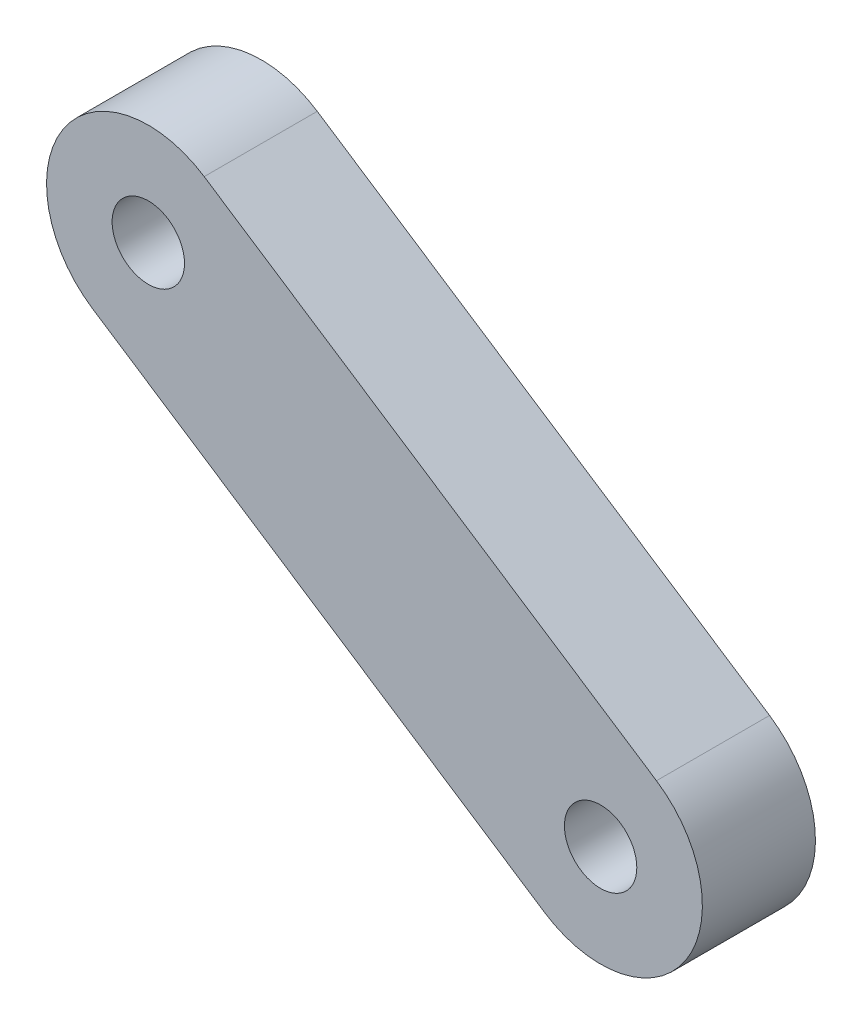
ISO-10303-21;
HEADER;
FILE_DESCRIPTION(('STEP AP214'),'2;1');
FILE_NAME('part.step','',(''),(''),'','','');
FILE_SCHEMA(('AUTOMOTIVE_DESIGN { 1 0 10303 214 1 1 1 1 }'));
ENDSEC;
DATA;
#1=APPLICATION_CONTEXT('core data for automotive mechanical design processes');
#2=APPLICATION_PROTOCOL_DEFINITION('international standard','automotive_design',2000,#1);
#3=PRODUCT_CONTEXT('',#1,'mechanical');
#4=PRODUCT('Part','Part','',(#3));
#5=PRODUCT_RELATED_PRODUCT_CATEGORY('part','',(#4));
#6=PRODUCT_DEFINITION_FORMATION('','',#4);
#7=PRODUCT_DEFINITION_CONTEXT('part definition',#1,'design');
#8=PRODUCT_DEFINITION('design','',#6,#7);
#9=PRODUCT_DEFINITION_SHAPE('','',#8);
#10=(LENGTH_UNIT() NAMED_UNIT(*) SI_UNIT(.MILLI.,.METRE.));
#11=(NAMED_UNIT(*) PLANE_ANGLE_UNIT() SI_UNIT($,.RADIAN.));
#12=(NAMED_UNIT(*) SI_UNIT($,.STERADIAN.) SOLID_ANGLE_UNIT());
#13=UNCERTAINTY_MEASURE_WITH_UNIT(LENGTH_MEASURE(1.E-05),#10,'distance_accuracy_value','');
#14=(GEOMETRIC_REPRESENTATION_CONTEXT(3) GLOBAL_UNCERTAINTY_ASSIGNED_CONTEXT((#13)) GLOBAL_UNIT_ASSIGNED_CONTEXT((#10,
#11,#12)) REPRESENTATION_CONTEXT('',''));
#15=CARTESIAN_POINT('',(0.,0.,0.));
#16=DIRECTION('',(0.,0.,1.));
#17=DIRECTION('',(1.,0.,0.));
#18=AXIS2_PLACEMENT_3D('',#15,#16,#17);
#19=CARTESIAN_POINT('',(-64.02985074626,0.,11.));
#20=DIRECTION('',(0.,0.,1.));
#21=DIRECTION('',(1.,0.,0.));
#22=AXIS2_PLACEMENT_3D('',#19,#20,#21);
#23=CYLINDRICAL_SURFACE('',#22,1.6);
#24=DIRECTION('',(0.,0.,1.));
#25=VECTOR('',#24,1.);
#26=CARTESIAN_POINT('',(-62.42985074626,0.,11.));
#27=LINE('',#26,#25);
#28=CARTESIAN_POINT('',(-62.42985074626,0.,18.5));
#29=VERTEX_POINT('',#28);
#30=CARTESIAN_POINT('',(-62.42985074626,0.,23.5));
#31=VERTEX_POINT('',#30);
#32=EDGE_CURVE('E10',#29,#31,#27,.T.);
#33=ORIENTED_EDGE('',*,*,#32,.F.);
#34=CARTESIAN_POINT('',(-64.02985074626,0.,18.5));
#35=DIRECTION('',(0.,0.,1.));
#36=DIRECTION('',(1.,0.,0.));
#37=AXIS2_PLACEMENT_3D('',#34,#35,#36);
#38=CIRCLE('',#37,1.6);
#39=EDGE_CURVE('E134',#29,#29,#38,.T.);
#40=ORIENTED_EDGE('',*,*,#39,.F.);
#41=ORIENTED_EDGE('',*,*,#32,.T.);
#42=CARTESIAN_POINT('',(-64.02985074626,0.,23.5));
#43=DIRECTION('',(0.,0.,1.));
#44=DIRECTION('',(1.,0.,0.));
#45=AXIS2_PLACEMENT_3D('',#42,#43,#44);
#46=CIRCLE('',#45,1.6);
#47=EDGE_CURVE('E116',#31,#31,#46,.T.);
#48=ORIENTED_EDGE('',*,*,#47,.T.);
#49=EDGE_LOOP('',(#33,#40,#41,#48));
#50=FACE_BOUND('',#49,.T.);
#51=ADVANCED_FACE('F16',(#50),#23,.F.);
#52=CARTESIAN_POINT('',(-44.02985074626,-13.1343283582,11.));
#53=DIRECTION('',(0.,0.,1.));
#54=DIRECTION('',(1.,0.,0.));
#55=AXIS2_PLACEMENT_3D('',#52,#53,#54);
#56=CYLINDRICAL_SURFACE('',#55,1.6);
#57=DIRECTION('',(0.,0.,1.));
#58=VECTOR('',#57,1.);
#59=CARTESIAN_POINT('',(-42.42985074626,-13.1343283582,11.));
#60=LINE('',#59,#58);
#61=CARTESIAN_POINT('',(-42.42985074626,-13.1343283582,18.5));
#62=VERTEX_POINT('',#61);
#63=CARTESIAN_POINT('',(-42.42985074626,-13.1343283582,23.5));
#64=VERTEX_POINT('',#63);
#65=EDGE_CURVE('E27',#62,#64,#60,.T.);
#66=ORIENTED_EDGE('',*,*,#65,.F.);
#67=CARTESIAN_POINT('',(-44.02985074626,-13.1343283582,18.5));
#68=DIRECTION('',(0.,0.,1.));
#69=DIRECTION('',(1.,0.,0.));
#70=AXIS2_PLACEMENT_3D('',#67,#68,#69);
#71=CIRCLE('',#70,1.6);
#72=EDGE_CURVE('E92',#62,#62,#71,.T.);
#73=ORIENTED_EDGE('',*,*,#72,.F.);
#74=ORIENTED_EDGE('',*,*,#65,.T.);
#75=CARTESIAN_POINT('',(-44.02985074626,-13.1343283582,23.5));
#76=DIRECTION('',(0.,0.,1.));
#77=DIRECTION('',(1.,0.,0.));
#78=AXIS2_PLACEMENT_3D('',#75,#76,#77);
#79=CIRCLE('',#78,1.6);
#80=EDGE_CURVE('E123',#64,#64,#79,.T.);
#81=ORIENTED_EDGE('',*,*,#80,.T.);
#82=EDGE_LOOP('',(#66,#73,#74,#81));
#83=FACE_BOUND('',#82,.T.);
#84=ADVANCED_FACE('F184',(#83),#56,.F.);
#85=CARTESIAN_POINT('',(-44.02985074626,-13.1343283582,18.5));
#86=DIRECTION('',(0.,0.,-1.));
#87=DIRECTION('',(-0.835869034479104,0.548928918166068,0.));
#88=AXIS2_PLACEMENT_3D('',#85,#86,#87);
#89=CYLINDRICAL_SURFACE('',#88,4.5);
#90=DIRECTION('',(0.,0.,1.));
#91=VECTOR('',#90,1.);
#92=CARTESIAN_POINT('',(-41.55967061452,-9.372917703052,18.5));
#93=LINE('',#92,#91);
#94=CARTESIAN_POINT('',(-41.55967061452,-9.372917703052,18.5));
#95=VERTEX_POINT('',#94);
#96=CARTESIAN_POINT('',(-41.55967061452,-9.372917703052,23.5));
#97=VERTEX_POINT('',#96);
#98=EDGE_CURVE('E85',#95,#97,#93,.T.);
#99=ORIENTED_EDGE('',*,*,#98,.T.);
#100=CARTESIAN_POINT('',(-44.02985074626,-13.1343283582,23.5));
#101=DIRECTION('',(0.,0.,-1.));
#102=DIRECTION('',(-0.835869034479104,0.548928918166068,0.));
#103=AXIS2_PLACEMENT_3D('',#100,#101,#102);
#104=CIRCLE('',#103,4.5);
#105=CARTESIAN_POINT('',(-46.50003087801,-16.89573901336,23.5));
#106=VERTEX_POINT('',#105);
#107=EDGE_CURVE('E73',#97,#106,#104,.T.);
#108=ORIENTED_EDGE('',*,*,#107,.T.);
#109=DIRECTION('',(0.,0.,1.));
#110=VECTOR('',#109,1.);
#111=CARTESIAN_POINT('',(-46.50003087801,-16.89573901336,18.5));
#112=LINE('',#111,#110);
#113=CARTESIAN_POINT('',(-46.50003087801,-16.89573901336,18.5));
#114=VERTEX_POINT('',#113);
#115=EDGE_CURVE('E20',#114,#106,#112,.T.);
#116=ORIENTED_EDGE('',*,*,#115,.F.);
#117=CARTESIAN_POINT('',(-44.02985074626,-13.1343283582,18.5));
#118=DIRECTION('',(0.,0.,-1.));
#119=DIRECTION('',(-0.835869034479104,0.548928918166068,0.));
#120=AXIS2_PLACEMENT_3D('',#117,#118,#119);
#121=CIRCLE('',#120,4.5);
#122=EDGE_CURVE('E81',#95,#114,#121,.T.);
#123=ORIENTED_EDGE('',*,*,#122,.F.);
#124=EDGE_LOOP('',(#99,#108,#116,#123));
#125=FACE_BOUND('',#124,.T.);
#126=ADVANCED_FACE('F83',(#125),#89,.T.);
#127=CARTESIAN_POINT('',(-54.02985074626,-6.567164179104,23.5));
#128=DIRECTION('',(0.,0.,1.));
#129=DIRECTION('',(1.,0.,0.));
#130=AXIS2_PLACEMENT_3D('',#127,#128,#129);
#131=PLANE('',#130);
#132=ORIENTED_EDGE('',*,*,#47,.F.);
#133=EDGE_LOOP('',(#132));
#134=FACE_BOUND('',#133,.T.);
#135=ORIENTED_EDGE('',*,*,#80,.F.);
#136=EDGE_LOOP('',(#135));
#137=FACE_BOUND('',#136,.T.);
#138=CARTESIAN_POINT('',(-64.02985074626,0.,23.5));
#139=DIRECTION('',(0.,0.,-1.));
#140=DIRECTION('',(0.835869034479104,-0.548928918166068,0.));
#141=AXIS2_PLACEMENT_3D('',#138,#139,#140);
#142=CIRCLE('',#141,4.5);
#143=CARTESIAN_POINT('',(-66.50003087801,-3.761410655157,23.5));
#144=VERTEX_POINT('',#143);
#145=CARTESIAN_POINT('',(-61.55967061452,3.761410655157,23.5));
#146=VERTEX_POINT('',#145);
#147=EDGE_CURVE('E136',#144,#146,#142,.T.);
#148=ORIENTED_EDGE('',*,*,#147,.F.);
#149=DIRECTION('',(-0.835869034479104,0.548928918166068,0.));
#150=VECTOR('',#149,1.);
#151=CARTESIAN_POINT('',(-46.50003087801,-16.89573901336,23.5));
#152=LINE('',#151,#150);
#153=EDGE_CURVE('E113',#106,#144,#152,.T.);
#154=ORIENTED_EDGE('',*,*,#153,.F.);
#155=ORIENTED_EDGE('',*,*,#107,.F.);
#156=DIRECTION('',(0.835869034479104,-0.548928918166068,0.));
#157=VECTOR('',#156,1.);
#158=CARTESIAN_POINT('',(-61.55967061452,3.761410655157,23.5));
#159=LINE('',#158,#157);
#160=EDGE_CURVE('E104',#146,#97,#159,.T.);
#161=ORIENTED_EDGE('',*,*,#160,.F.);
#162=EDGE_LOOP('',(#148,#154,#155,#161));
#163=FACE_BOUND('',#162,.T.);
#164=ADVANCED_FACE('F161',(#134,#137,#163),#131,.T.);
#165=CARTESIAN_POINT('',(-54.02985074626,-6.567164179104,18.5));
#166=DIRECTION('',(0.,0.,1.));
#167=DIRECTION('',(1.,0.,0.));
#168=AXIS2_PLACEMENT_3D('',#165,#166,#167);
#169=PLANE('',#168);
#170=ORIENTED_EDGE('',*,*,#39,.T.);
#171=EDGE_LOOP('',(#170));
#172=FACE_BOUND('',#171,.T.);
#173=ORIENTED_EDGE('',*,*,#72,.T.);
#174=EDGE_LOOP('',(#173));
#175=FACE_BOUND('',#174,.T.);
#176=DIRECTION('',(-0.835869034479104,0.548928918166068,0.));
#177=VECTOR('',#176,1.);
#178=CARTESIAN_POINT('',(-41.55967061452,-9.372917703052,18.5));
#179=LINE('',#178,#177);
#180=CARTESIAN_POINT('',(-61.55967061452,3.761410655157,18.5));
#181=VERTEX_POINT('',#180);
#182=EDGE_CURVE('E93',#95,#181,#179,.T.);
#183=ORIENTED_EDGE('',*,*,#182,.F.);
#184=ORIENTED_EDGE('',*,*,#122,.T.);
#185=DIRECTION('',(0.835869034479104,-0.548928918166068,0.));
#186=VECTOR('',#185,1.);
#187=CARTESIAN_POINT('',(-66.50003087801,-3.761410655157,18.5));
#188=LINE('',#187,#186);
#189=CARTESIAN_POINT('',(-66.50003087801,-3.761410655157,18.5));
#190=VERTEX_POINT('',#189);
#191=EDGE_CURVE('E110',#190,#114,#188,.T.);
#192=ORIENTED_EDGE('',*,*,#191,.F.);
#193=CARTESIAN_POINT('',(-64.02985074626,0.,18.5));
#194=DIRECTION('',(0.,0.,-1.));
#195=DIRECTION('',(0.835869034479104,-0.548928918166068,0.));
#196=AXIS2_PLACEMENT_3D('',#193,#194,#195);
#197=CIRCLE('',#196,4.5);
#198=EDGE_CURVE('E98',#190,#181,#197,.T.);
#199=ORIENTED_EDGE('',*,*,#198,.T.);
#200=EDGE_LOOP('',(#183,#184,#192,#199));
#201=FACE_BOUND('',#200,.T.);
#202=ADVANCED_FACE('F96',(#172,#175,#201),#169,.F.);
#203=CARTESIAN_POINT('',(-51.55967061452,-2.805753523947,18.5));
#204=DIRECTION('',(-0.548928918166068,-0.835869034479104,0.));
#205=DIRECTION('',(-0.835869034479104,0.548928918166068,0.));
#206=AXIS2_PLACEMENT_3D('',#203,#204,#205);
#207=PLANE('',#206);
#208=ORIENTED_EDGE('',*,*,#160,.T.);
#209=ORIENTED_EDGE('',*,*,#98,.F.);
#210=ORIENTED_EDGE('',*,*,#182,.T.);
#211=DIRECTION('',(0.,0.,1.));
#212=VECTOR('',#211,1.);
#213=CARTESIAN_POINT('',(-61.55967061452,3.761410655157,18.5));
#214=LINE('',#213,#212);
#215=EDGE_CURVE('E140',#181,#146,#214,.T.);
#216=ORIENTED_EDGE('',*,*,#215,.T.);
#217=EDGE_LOOP('',(#208,#209,#210,#216));
#218=FACE_BOUND('',#217,.T.);
#219=ADVANCED_FACE('F18',(#218),#207,.F.);
#220=CARTESIAN_POINT('',(-46.50003087801,-16.89573901336,18.5));
#221=DIRECTION('',(-0.548928918166068,-0.835869034479104,0.));
#222=DIRECTION('',(-0.835869034479104,0.548928918166068,0.));
#223=AXIS2_PLACEMENT_3D('',#220,#221,#222);
#224=PLANE('',#223);
#225=ORIENTED_EDGE('',*,*,#115,.T.);
#226=ORIENTED_EDGE('',*,*,#153,.T.);
#227=DIRECTION('',(0.,0.,1.));
#228=VECTOR('',#227,1.);
#229=CARTESIAN_POINT('',(-66.50003087801,-3.761410655157,18.5));
#230=LINE('',#229,#228);
#231=EDGE_CURVE('E141',#190,#144,#230,.T.);
#232=ORIENTED_EDGE('',*,*,#231,.F.);
#233=ORIENTED_EDGE('',*,*,#191,.T.);
#234=EDGE_LOOP('',(#225,#226,#232,#233));
#235=FACE_BOUND('',#234,.T.);
#236=ADVANCED_FACE('F173',(#235),#224,.T.);
#237=CARTESIAN_POINT('',(-64.02985074626,0.,18.5));
#238=DIRECTION('',(0.,0.,-1.));
#239=DIRECTION('',(0.835869034479104,-0.548928918166068,0.));
#240=AXIS2_PLACEMENT_3D('',#237,#238,#239);
#241=CYLINDRICAL_SURFACE('',#240,4.5);
#242=ORIENTED_EDGE('',*,*,#231,.T.);
#243=ORIENTED_EDGE('',*,*,#147,.T.);
#244=ORIENTED_EDGE('',*,*,#215,.F.);
#245=ORIENTED_EDGE('',*,*,#198,.F.);
#246=EDGE_LOOP('',(#242,#243,#244,#245));
#247=FACE_BOUND('',#246,.T.);
#248=ADVANCED_FACE('F159',(#247),#241,.T.);
#249=CLOSED_SHELL('',(#51,#84,#126,#164,#202,#219,#236,#248));
#250=MANIFOLD_SOLID_BREP('B1',#249);
#251=ADVANCED_BREP_SHAPE_REPRESENTATION('',(#18,#250),#14);
#252=SHAPE_DEFINITION_REPRESENTATION(#9,#251);
ENDSEC;
END-ISO-10303-21;
